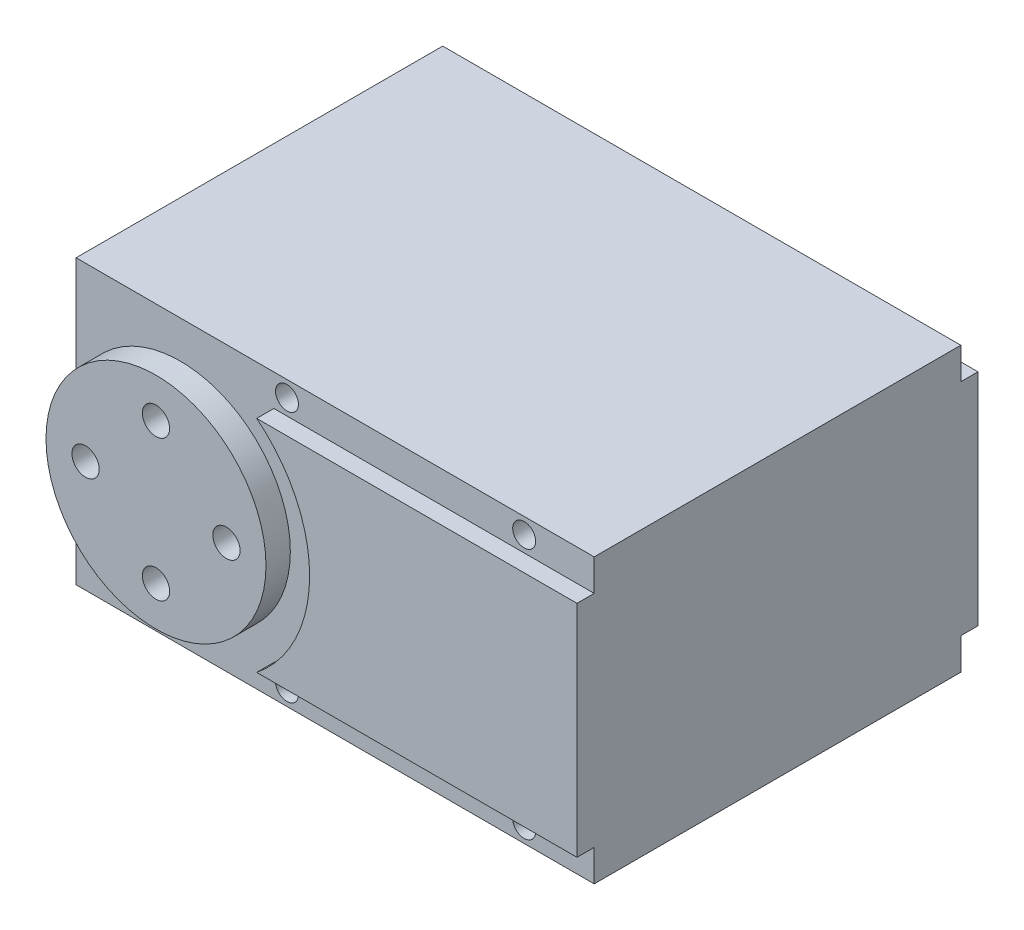
ISO-10303-21;
HEADER;
FILE_DESCRIPTION(('STEP AP214'),'2;1');
FILE_NAME('part.step','',(''),(''),'','','');
FILE_SCHEMA(('AUTOMOTIVE_DESIGN { 1 0 10303 214 1 1 1 1 }'));
ENDSEC;
DATA;
#1=APPLICATION_CONTEXT('core data for automotive mechanical design processes');
#2=APPLICATION_PROTOCOL_DEFINITION('international standard','automotive_design',2000,#1);
#3=PRODUCT_CONTEXT('',#1,'mechanical');
#4=PRODUCT('Part','Part','',(#3));
#5=PRODUCT_RELATED_PRODUCT_CATEGORY('part','',(#4));
#6=PRODUCT_DEFINITION_FORMATION('','',#4);
#7=PRODUCT_DEFINITION_CONTEXT('part definition',#1,'design');
#8=PRODUCT_DEFINITION('design','',#6,#7);
#9=PRODUCT_DEFINITION_SHAPE('','',#8);
#10=(LENGTH_UNIT() NAMED_UNIT(*) SI_UNIT(.MILLI.,.METRE.));
#11=(NAMED_UNIT(*) PLANE_ANGLE_UNIT() SI_UNIT($,.RADIAN.));
#12=(NAMED_UNIT(*) SI_UNIT($,.STERADIAN.) SOLID_ANGLE_UNIT());
#13=UNCERTAINTY_MEASURE_WITH_UNIT(LENGTH_MEASURE(1.E-05),#10,'distance_accuracy_value','');
#14=(GEOMETRIC_REPRESENTATION_CONTEXT(3) GLOBAL_UNCERTAINTY_ASSIGNED_CONTEXT((#13)) GLOBAL_UNIT_ASSIGNED_CONTEXT((#10,
#11,#12)) REPRESENTATION_CONTEXT('',''));
#15=CARTESIAN_POINT('',(0.,0.,0.));
#16=DIRECTION('',(0.,0.,1.));
#17=DIRECTION('',(1.,0.,0.));
#18=AXIS2_PLACEMENT_3D('',#15,#16,#17);
#19=CARTESIAN_POINT('',(-13.01,0.,-17.5));
#20=DIRECTION('',(0.,0.,1.));
#21=DIRECTION('',(1.,0.,0.));
#22=AXIS2_PLACEMENT_3D('',#19,#20,#21);
#23=CYLINDRICAL_SURFACE('',#22,12.28389093151);
#24=CARTESIAN_POINT('',(-13.01,0.,-16.));
#25=DIRECTION('',(0.,0.,1.));
#26=DIRECTION('',(1.,0.,0.));
#27=AXIS2_PLACEMENT_3D('',#24,#25,#26);
#28=CIRCLE('',#27,12.28389093151);
#29=CARTESIAN_POINT('',(-5.34619047619048,-9.6,-16.));
#30=VERTEX_POINT('',#29);
#31=CARTESIAN_POINT('',(-5.34619047619048,9.6,-16.));
#32=VERTEX_POINT('',#31);
#33=EDGE_CURVE('E232',#30,#32,#28,.T.);
#34=ORIENTED_EDGE('',*,*,#33,.T.);
#35=DIRECTION('',(0.,0.,1.));
#36=VECTOR('',#35,1.);
#37=CARTESIAN_POINT('',(-5.34619047619048,9.6,-17.5));
#38=LINE('',#37,#36);
#39=CARTESIAN_POINT('',(-5.34619047619048,9.6,-17.5));
#40=VERTEX_POINT('',#39);
#41=EDGE_CURVE('E11',#40,#32,#38,.T.);
#42=ORIENTED_EDGE('',*,*,#41,.F.);
#43=CARTESIAN_POINT('',(-13.01,0.,-17.5));
#44=DIRECTION('',(0.,0.,1.));
#45=DIRECTION('',(1.,0.,0.));
#46=AXIS2_PLACEMENT_3D('',#43,#44,#45);
#47=CIRCLE('',#46,12.28389093151);
#48=CARTESIAN_POINT('',(-5.34619047619048,-9.6,-17.5));
#49=VERTEX_POINT('',#48);
#50=EDGE_CURVE('E272',#49,#40,#47,.T.);
#51=ORIENTED_EDGE('',*,*,#50,.F.);
#52=DIRECTION('',(0.,0.,1.));
#53=VECTOR('',#52,1.);
#54=CARTESIAN_POINT('',(-5.34619047619048,-9.6,-17.5));
#55=LINE('',#54,#53);
#56=EDGE_CURVE('E295',#49,#30,#55,.T.);
#57=ORIENTED_EDGE('',*,*,#56,.T.);
#58=EDGE_LOOP('',(#34,#42,#51,#57));
#59=FACE_BOUND('',#58,.T.);
#60=ADVANCED_FACE('F41',(#59),#23,.F.);
#61=CARTESIAN_POINT('',(0.,9.6,-17.5));
#62=DIRECTION('',(0.,-1.,0.));
#63=DIRECTION('',(1.,0.,0.));
#64=AXIS2_PLACEMENT_3D('',#61,#62,#63);
#65=PLANE('',#64);
#66=DIRECTION('',(1.,0.,0.));
#67=VECTOR('',#66,1.);
#68=CARTESIAN_POINT('',(0.,9.6,-16.));
#69=LINE('',#68,#67);
#70=CARTESIAN_POINT('',(22.61,9.6,-16.));
#71=VERTEX_POINT('',#70);
#72=EDGE_CURVE('E231',#32,#71,#69,.T.);
#73=ORIENTED_EDGE('',*,*,#72,.T.);
#74=DIRECTION('',(0.,0.,1.));
#75=VECTOR('',#74,1.);
#76=CARTESIAN_POINT('',(22.61,9.6,-17.5));
#77=LINE('',#76,#75);
#78=CARTESIAN_POINT('',(22.61,9.6,-17.5));
#79=VERTEX_POINT('',#78);
#80=EDGE_CURVE('E284',#79,#71,#77,.T.);
#81=ORIENTED_EDGE('',*,*,#80,.F.);
#82=DIRECTION('',(1.,0.,0.));
#83=VECTOR('',#82,1.);
#84=CARTESIAN_POINT('',(0.,9.6,-17.5));
#85=LINE('',#84,#83);
#86=EDGE_CURVE('E285',#40,#79,#85,.T.);
#87=ORIENTED_EDGE('',*,*,#86,.F.);
#88=ORIENTED_EDGE('',*,*,#41,.T.);
#89=EDGE_LOOP('',(#73,#81,#87,#88));
#90=FACE_BOUND('',#89,.T.);
#91=ADVANCED_FACE('F348',(#90),#65,.F.);
#92=CARTESIAN_POINT('',(0.,-9.6,-17.5));
#93=DIRECTION('',(0.,-1.,0.));
#94=DIRECTION('',(0.,0.,-1.));
#95=AXIS2_PLACEMENT_3D('',#92,#93,#94);
#96=PLANE('',#95);
#97=DIRECTION('',(0.,0.,1.));
#98=VECTOR('',#97,1.);
#99=CARTESIAN_POINT('',(22.61,-9.6,-17.5));
#100=LINE('',#99,#98);
#101=CARTESIAN_POINT('',(22.61,-9.6,-17.5));
#102=VERTEX_POINT('',#101);
#103=CARTESIAN_POINT('',(22.61,-9.6,-16.));
#104=VERTEX_POINT('',#103);
#105=EDGE_CURVE('E290',#102,#104,#100,.T.);
#106=ORIENTED_EDGE('',*,*,#105,.T.);
#107=DIRECTION('',(1.,0.,0.));
#108=VECTOR('',#107,1.);
#109=CARTESIAN_POINT('',(0.,-9.6,-16.));
#110=LINE('',#109,#108);
#111=EDGE_CURVE('E229',#30,#104,#110,.T.);
#112=ORIENTED_EDGE('',*,*,#111,.F.);
#113=ORIENTED_EDGE('',*,*,#56,.F.);
#114=DIRECTION('',(1.,0.,0.));
#115=VECTOR('',#114,1.);
#116=CARTESIAN_POINT('',(0.,-9.6,-17.5));
#117=LINE('',#116,#115);
#118=EDGE_CURVE('E277',#49,#102,#117,.T.);
#119=ORIENTED_EDGE('',*,*,#118,.T.);
#120=EDGE_LOOP('',(#106,#112,#113,#119));
#121=FACE_BOUND('',#120,.T.);
#122=ADVANCED_FACE('F358',(#121),#96,.T.);
#123=CARTESIAN_POINT('',(-5.34619047619048,9.6,16.));
#124=VERTEX_POINT('',#123);
#125=CARTESIAN_POINT('',(-5.34619047619048,9.6,17.5));
#126=VERTEX_POINT('',#125);
#127=EDGE_CURVE('E49',#124,#126,#38,.T.);
#128=ORIENTED_EDGE('',*,*,#127,.F.);
#129=CARTESIAN_POINT('',(-13.01,0.,16.));
#130=DIRECTION('',(0.,0.,1.));
#131=DIRECTION('',(1.,0.,0.));
#132=AXIS2_PLACEMENT_3D('',#129,#130,#131);
#133=CIRCLE('',#132,12.28389093151);
#134=CARTESIAN_POINT('',(-5.34619047619048,-9.6,16.));
#135=VERTEX_POINT('',#134);
#136=EDGE_CURVE('E200',#135,#124,#133,.T.);
#137=ORIENTED_EDGE('',*,*,#136,.F.);
#138=CARTESIAN_POINT('',(-5.34619047619048,-9.6,17.5));
#139=VERTEX_POINT('',#138);
#140=EDGE_CURVE('E282',#135,#139,#55,.T.);
#141=ORIENTED_EDGE('',*,*,#140,.T.);
#142=CARTESIAN_POINT('',(-13.01,0.,17.5));
#143=DIRECTION('',(0.,0.,1.));
#144=DIRECTION('',(1.,0.,0.));
#145=AXIS2_PLACEMENT_3D('',#142,#143,#144);
#146=CIRCLE('',#145,12.28389093151);
#147=EDGE_CURVE('E254',#139,#126,#146,.T.);
#148=ORIENTED_EDGE('',*,*,#147,.T.);
#149=EDGE_LOOP('',(#128,#137,#141,#148));
#150=FACE_BOUND('',#149,.T.);
#151=ADVANCED_FACE('F43',(#150),#23,.F.);
#152=CARTESIAN_POINT('',(22.61,9.6,16.));
#153=VERTEX_POINT('',#152);
#154=CARTESIAN_POINT('',(22.61,9.6,17.5));
#155=VERTEX_POINT('',#154);
#156=EDGE_CURVE('E287',#153,#155,#77,.T.);
#157=ORIENTED_EDGE('',*,*,#156,.F.);
#158=DIRECTION('',(1.,0.,0.));
#159=VECTOR('',#158,1.);
#160=CARTESIAN_POINT('',(0.,9.6,16.));
#161=LINE('',#160,#159);
#162=EDGE_CURVE('E62',#124,#153,#161,.T.);
#163=ORIENTED_EDGE('',*,*,#162,.F.);
#164=ORIENTED_EDGE('',*,*,#127,.T.);
#165=DIRECTION('',(1.,0.,0.));
#166=VECTOR('',#165,1.);
#167=CARTESIAN_POINT('',(0.,9.6,17.5));
#168=LINE('',#167,#166);
#169=EDGE_CURVE('E269',#126,#155,#168,.T.);
#170=ORIENTED_EDGE('',*,*,#169,.T.);
#171=EDGE_LOOP('',(#157,#163,#164,#170));
#172=FACE_BOUND('',#171,.T.);
#173=ADVANCED_FACE('F360',(#172),#65,.F.);
#174=CARTESIAN_POINT('',(22.61,0.,-17.5));
#175=DIRECTION('',(1.,0.,0.));
#176=DIRECTION('',(0.,0.,-1.));
#177=AXIS2_PLACEMENT_3D('',#174,#175,#176);
#178=PLANE('',#177);
#179=ORIENTED_EDGE('',*,*,#80,.T.);
#180=DIRECTION('',(0.,1.,0.));
#181=VECTOR('',#180,1.);
#182=CARTESIAN_POINT('',(22.61,0.,-16.));
#183=LINE('',#182,#181);
#184=CARTESIAN_POINT('',(22.61,12.36,-16.));
#185=VERTEX_POINT('',#184);
#186=EDGE_CURVE('E240',#71,#185,#183,.T.);
#187=ORIENTED_EDGE('',*,*,#186,.T.);
#188=DIRECTION('',(0.,0.,1.));
#189=VECTOR('',#188,1.);
#190=CARTESIAN_POINT('',(22.61,12.36,-16.));
#191=LINE('',#190,#189);
#192=CARTESIAN_POINT('',(22.61,12.36,16.));
#193=VERTEX_POINT('',#192);
#194=EDGE_CURVE('E251',#185,#193,#191,.T.);
#195=ORIENTED_EDGE('',*,*,#194,.T.);
#196=DIRECTION('',(0.,1.,0.));
#197=VECTOR('',#196,1.);
#198=CARTESIAN_POINT('',(22.61,0.,16.));
#199=LINE('',#198,#197);
#200=EDGE_CURVE('E201',#153,#193,#199,.T.);
#201=ORIENTED_EDGE('',*,*,#200,.F.);
#202=ORIENTED_EDGE('',*,*,#156,.T.);
#203=DIRECTION('',(0.,1.,0.));
#204=VECTOR('',#203,1.);
#205=CARTESIAN_POINT('',(22.61,0.,17.5));
#206=LINE('',#205,#204);
#207=CARTESIAN_POINT('',(22.61,-9.6,17.5));
#208=VERTEX_POINT('',#207);
#209=EDGE_CURVE('E270',#208,#155,#206,.T.);
#210=ORIENTED_EDGE('',*,*,#209,.F.);
#211=CARTESIAN_POINT('',(22.61,-9.6,16.));
#212=VERTEX_POINT('',#211);
#213=EDGE_CURVE('E292',#212,#208,#100,.T.);
#214=ORIENTED_EDGE('',*,*,#213,.F.);
#215=DIRECTION('',(0.,1.,0.));
#216=VECTOR('',#215,1.);
#217=CARTESIAN_POINT('',(22.61,0.,16.));
#218=LINE('',#217,#216);
#219=CARTESIAN_POINT('',(22.61,-12.36,16.));
#220=VERTEX_POINT('',#219);
#221=EDGE_CURVE('E195',#220,#212,#218,.T.);
#222=ORIENTED_EDGE('',*,*,#221,.F.);
#223=DIRECTION('',(0.,0.,1.));
#224=VECTOR('',#223,1.);
#225=CARTESIAN_POINT('',(22.61,-12.36,-16.));
#226=LINE('',#225,#224);
#227=CARTESIAN_POINT('',(22.61,-12.36,-16.));
#228=VERTEX_POINT('',#227);
#229=EDGE_CURVE('E258',#228,#220,#226,.T.);
#230=ORIENTED_EDGE('',*,*,#229,.F.);
#231=DIRECTION('',(0.,1.,0.));
#232=VECTOR('',#231,1.);
#233=CARTESIAN_POINT('',(22.61,0.,-16.));
#234=LINE('',#233,#232);
#235=EDGE_CURVE('E230',#228,#104,#234,.T.);
#236=ORIENTED_EDGE('',*,*,#235,.T.);
#237=ORIENTED_EDGE('',*,*,#105,.F.);
#238=DIRECTION('',(0.,1.,0.));
#239=VECTOR('',#238,1.);
#240=CARTESIAN_POINT('',(22.61,0.,-17.5));
#241=LINE('',#240,#239);
#242=EDGE_CURVE('E276',#102,#79,#241,.T.);
#243=ORIENTED_EDGE('',*,*,#242,.T.);
#244=EDGE_LOOP('',(#179,#187,#195,#201,#202,#210,#214,#222,#230,#236,#237,#243));
#245=FACE_BOUND('',#244,.T.);
#246=ADVANCED_FACE('F368',(#245),#178,.T.);
#247=DIRECTION('',(1.,0.,0.));
#248=VECTOR('',#247,1.);
#249=CARTESIAN_POINT('',(0.,-9.6,16.));
#250=LINE('',#249,#248);
#251=EDGE_CURVE('E197',#135,#212,#250,.T.);
#252=ORIENTED_EDGE('',*,*,#251,.T.);
#253=ORIENTED_EDGE('',*,*,#213,.T.);
#254=DIRECTION('',(1.,0.,0.));
#255=VECTOR('',#254,1.);
#256=CARTESIAN_POINT('',(0.,-9.6,17.5));
#257=LINE('',#256,#255);
#258=EDGE_CURVE('E262',#139,#208,#257,.T.);
#259=ORIENTED_EDGE('',*,*,#258,.F.);
#260=ORIENTED_EDGE('',*,*,#140,.F.);
#261=EDGE_LOOP('',(#252,#253,#259,#260));
#262=FACE_BOUND('',#261,.T.);
#263=ADVANCED_FACE('F366',(#262),#96,.T.);
#264=CARTESIAN_POINT('',(0.,0.,-17.5));
#265=DIRECTION('',(0.,0.,1.));
#266=DIRECTION('',(1.,0.,0.));
#267=AXIS2_PLACEMENT_3D('',#264,#265,#266);
#268=PLANE('',#267);
#269=ORIENTED_EDGE('',*,*,#50,.T.);
#270=ORIENTED_EDGE('',*,*,#86,.T.);
#271=ORIENTED_EDGE('',*,*,#242,.F.);
#272=ORIENTED_EDGE('',*,*,#118,.F.);
#273=EDGE_LOOP('',(#269,#270,#271,#272));
#274=FACE_BOUND('',#273,.T.);
#275=ADVANCED_FACE('F390',(#274),#268,.F.);
#276=CARTESIAN_POINT('',(0.,0.,17.5));
#277=DIRECTION('',(0.,0.,1.));
#278=DIRECTION('',(1.,0.,0.));
#279=AXIS2_PLACEMENT_3D('',#276,#277,#278);
#280=PLANE('',#279);
#281=ORIENTED_EDGE('',*,*,#147,.F.);
#282=ORIENTED_EDGE('',*,*,#258,.T.);
#283=ORIENTED_EDGE('',*,*,#209,.T.);
#284=ORIENTED_EDGE('',*,*,#169,.F.);
#285=EDGE_LOOP('',(#281,#282,#283,#284));
#286=FACE_BOUND('',#285,.T.);
#287=ADVANCED_FACE('F384',(#286),#280,.T.);
#288=CARTESIAN_POINT('',(0.,12.36,-16.));
#289=DIRECTION('',(0.,-1.,0.));
#290=DIRECTION('',(0.,0.,-1.));
#291=AXIS2_PLACEMENT_3D('',#288,#289,#290);
#292=PLANE('',#291);
#293=DIRECTION('',(0.,0.,1.));
#294=VECTOR('',#293,1.);
#295=CARTESIAN_POINT('',(-22.61,12.36,-16.));
#296=LINE('',#295,#294);
#297=CARTESIAN_POINT('',(-22.61,12.36,-16.));
#298=VERTEX_POINT('',#297);
#299=CARTESIAN_POINT('',(-22.61,12.36,16.));
#300=VERTEX_POINT('',#299);
#301=EDGE_CURVE('E252',#298,#300,#296,.T.);
#302=ORIENTED_EDGE('',*,*,#301,.T.);
#303=DIRECTION('',(1.,0.,0.));
#304=VECTOR('',#303,1.);
#305=CARTESIAN_POINT('',(0.,12.36,16.));
#306=LINE('',#305,#304);
#307=EDGE_CURVE('E186',#300,#193,#306,.T.);
#308=ORIENTED_EDGE('',*,*,#307,.T.);
#309=ORIENTED_EDGE('',*,*,#194,.F.);
#310=DIRECTION('',(1.,0.,0.));
#311=VECTOR('',#310,1.);
#312=CARTESIAN_POINT('',(0.,12.36,-16.));
#313=LINE('',#312,#311);
#314=EDGE_CURVE('E217',#298,#185,#313,.T.);
#315=ORIENTED_EDGE('',*,*,#314,.F.);
#316=EDGE_LOOP('',(#302,#308,#309,#315));
#317=FACE_BOUND('',#316,.T.);
#318=ADVANCED_FACE('F387',(#317),#292,.F.);
#319=CARTESIAN_POINT('',(0.,-12.36,-16.));
#320=DIRECTION('',(0.,-1.,0.));
#321=DIRECTION('',(0.,0.,-1.));
#322=AXIS2_PLACEMENT_3D('',#319,#320,#321);
#323=PLANE('',#322);
#324=ORIENTED_EDGE('',*,*,#229,.T.);
#325=DIRECTION('',(1.,0.,0.));
#326=VECTOR('',#325,1.);
#327=CARTESIAN_POINT('',(0.,-12.36,16.));
#328=LINE('',#327,#326);
#329=CARTESIAN_POINT('',(-22.61,-12.36,16.));
#330=VERTEX_POINT('',#329);
#331=EDGE_CURVE('E193',#330,#220,#328,.T.);
#332=ORIENTED_EDGE('',*,*,#331,.F.);
#333=DIRECTION('',(0.,0.,1.));
#334=VECTOR('',#333,1.);
#335=CARTESIAN_POINT('',(-22.61,-12.36,-16.));
#336=LINE('',#335,#334);
#337=CARTESIAN_POINT('',(-22.61,-12.36,-16.));
#338=VERTEX_POINT('',#337);
#339=EDGE_CURVE('E256',#338,#330,#336,.T.);
#340=ORIENTED_EDGE('',*,*,#339,.F.);
#341=DIRECTION('',(1.,0.,0.));
#342=VECTOR('',#341,1.);
#343=CARTESIAN_POINT('',(0.,-12.36,-16.));
#344=LINE('',#343,#342);
#345=EDGE_CURVE('E221',#338,#228,#344,.T.);
#346=ORIENTED_EDGE('',*,*,#345,.T.);
#347=EDGE_LOOP('',(#324,#332,#340,#346));
#348=FACE_BOUND('',#347,.T.);
#349=ADVANCED_FACE('F392',(#348),#323,.T.);
#350=CARTESIAN_POINT('',(-4.2,-10.98,-16.));
#351=DIRECTION('',(0.,0.,1.));
#352=DIRECTION('',(1.,0.,0.));
#353=AXIS2_PLACEMENT_3D('',#350,#351,#352);
#354=CYLINDRICAL_SURFACE('',#353,1.);
#355=CARTESIAN_POINT('',(-4.2,-10.98,-16.));
#356=DIRECTION('',(0.,0.,1.));
#357=DIRECTION('',(1.,0.,0.));
#358=AXIS2_PLACEMENT_3D('',#355,#356,#357);
#359=CIRCLE('',#358,1.);
#360=CARTESIAN_POINT('',(-3.19999999999999,-10.98,-16.));
#361=VERTEX_POINT('',#360);
#362=EDGE_CURVE('E248',#361,#361,#359,.T.);
#363=ORIENTED_EDGE('',*,*,#362,.F.);
#364=EDGE_LOOP('',(#363));
#365=FACE_BOUND('',#364,.T.);
#366=CARTESIAN_POINT('',(-4.2,-10.98,16.));
#367=DIRECTION('',(0.,0.,1.));
#368=DIRECTION('',(1.,0.,0.));
#369=AXIS2_PLACEMENT_3D('',#366,#367,#368);
#370=CIRCLE('',#369,1.);
#371=CARTESIAN_POINT('',(-3.19999999999999,-10.98,16.));
#372=VERTEX_POINT('',#371);
#373=EDGE_CURVE('E215',#372,#372,#370,.T.);
#374=ORIENTED_EDGE('',*,*,#373,.T.);
#375=EDGE_LOOP('',(#374));
#376=FACE_BOUND('',#375,.T.);
#377=ADVANCED_FACE('F419',(#365,#376),#354,.F.);
#378=CARTESIAN_POINT('',(-4.2,10.98,-16.));
#379=DIRECTION('',(0.,0.,1.));
#380=DIRECTION('',(1.,0.,0.));
#381=AXIS2_PLACEMENT_3D('',#378,#379,#380);
#382=CYLINDRICAL_SURFACE('',#381,1.);
#383=CARTESIAN_POINT('',(-4.2,10.98,-16.));
#384=DIRECTION('',(0.,0.,1.));
#385=DIRECTION('',(1.,0.,0.));
#386=AXIS2_PLACEMENT_3D('',#383,#384,#385);
#387=CIRCLE('',#386,1.);
#388=CARTESIAN_POINT('',(-3.19999999999999,10.98,-16.));
#389=VERTEX_POINT('',#388);
#390=EDGE_CURVE('E242',#389,#389,#387,.F.);
#391=ORIENTED_EDGE('',*,*,#390,.T.);
#392=EDGE_LOOP('',(#391));
#393=FACE_BOUND('',#392,.T.);
#394=CARTESIAN_POINT('',(-4.2,10.98,16.));
#395=DIRECTION('',(0.,0.,1.));
#396=DIRECTION('',(1.,0.,0.));
#397=AXIS2_PLACEMENT_3D('',#394,#395,#396);
#398=CIRCLE('',#397,1.);
#399=CARTESIAN_POINT('',(-3.19999999999999,10.98,16.));
#400=VERTEX_POINT('',#399);
#401=EDGE_CURVE('E207',#400,#400,#398,.F.);
#402=ORIENTED_EDGE('',*,*,#401,.F.);
#403=EDGE_LOOP('',(#402));
#404=FACE_BOUND('',#403,.T.);
#405=ADVANCED_FACE('F427',(#393,#404),#382,.F.);
#406=CARTESIAN_POINT('',(16.5,10.98,-16.));
#407=DIRECTION('',(0.,0.,1.));
#408=DIRECTION('',(1.,0.,0.));
#409=AXIS2_PLACEMENT_3D('',#406,#407,#408);
#410=CYLINDRICAL_SURFACE('',#409,1.);
#411=CARTESIAN_POINT('',(16.5,10.98,-16.));
#412=DIRECTION('',(0.,0.,1.));
#413=DIRECTION('',(1.,0.,0.));
#414=AXIS2_PLACEMENT_3D('',#411,#412,#413);
#415=CIRCLE('',#414,1.);
#416=CARTESIAN_POINT('',(17.5,10.98,-16.));
#417=VERTEX_POINT('',#416);
#418=EDGE_CURVE('E238',#417,#417,#415,.F.);
#419=ORIENTED_EDGE('',*,*,#418,.T.);
#420=EDGE_LOOP('',(#419));
#421=FACE_BOUND('',#420,.T.);
#422=CARTESIAN_POINT('',(16.5,10.98,16.));
#423=DIRECTION('',(0.,0.,1.));
#424=DIRECTION('',(1.,0.,0.));
#425=AXIS2_PLACEMENT_3D('',#422,#423,#424);
#426=CIRCLE('',#425,1.);
#427=CARTESIAN_POINT('',(17.5,10.98,16.));
#428=VERTEX_POINT('',#427);
#429=EDGE_CURVE('E206',#428,#428,#426,.F.);
#430=ORIENTED_EDGE('',*,*,#429,.F.);
#431=EDGE_LOOP('',(#430));
#432=FACE_BOUND('',#431,.T.);
#433=ADVANCED_FACE('F437',(#421,#432),#410,.F.);
#434=CARTESIAN_POINT('',(-22.61,0.,-16.));
#435=DIRECTION('',(1.,0.,0.));
#436=DIRECTION('',(0.,0.,-1.));
#437=AXIS2_PLACEMENT_3D('',#434,#435,#436);
#438=PLANE('',#437);
#439=DIRECTION('',(0.,1.,0.));
#440=VECTOR('',#439,1.);
#441=CARTESIAN_POINT('',(-22.61,0.,-16.));
#442=LINE('',#441,#440);
#443=CARTESIAN_POINT('',(-22.61,0.,-16.));
#444=VERTEX_POINT('',#443);
#445=EDGE_CURVE('E219',#444,#298,#442,.T.);
#446=ORIENTED_EDGE('',*,*,#445,.F.);
#447=EDGE_CURVE('E222',#338,#444,#442,.T.);
#448=ORIENTED_EDGE('',*,*,#447,.F.);
#449=ORIENTED_EDGE('',*,*,#339,.T.);
#450=DIRECTION('',(0.,1.,0.));
#451=VECTOR('',#450,1.);
#452=CARTESIAN_POINT('',(-22.61,0.,16.));
#453=LINE('',#452,#451);
#454=EDGE_CURVE('E188',#330,#300,#453,.T.);
#455=ORIENTED_EDGE('',*,*,#454,.T.);
#456=ORIENTED_EDGE('',*,*,#301,.F.);
#457=EDGE_LOOP('',(#446,#448,#449,#455,#456));
#458=FACE_BOUND('',#457,.T.);
#459=ADVANCED_FACE('F450',(#458),#438,.F.);
#460=CARTESIAN_POINT('',(16.5,-10.98,-16.));
#461=DIRECTION('',(0.,0.,1.));
#462=DIRECTION('',(1.,0.,0.));
#463=AXIS2_PLACEMENT_3D('',#460,#461,#462);
#464=CYLINDRICAL_SURFACE('',#463,1.);
#465=CARTESIAN_POINT('',(16.5,-10.98,-16.));
#466=DIRECTION('',(0.,0.,1.));
#467=DIRECTION('',(1.,0.,0.));
#468=AXIS2_PLACEMENT_3D('',#465,#466,#467);
#469=CIRCLE('',#468,1.);
#470=CARTESIAN_POINT('',(17.5,-10.98,-16.));
#471=VERTEX_POINT('',#470);
#472=EDGE_CURVE('E250',#471,#471,#469,.T.);
#473=ORIENTED_EDGE('',*,*,#472,.F.);
#474=EDGE_LOOP('',(#473));
#475=FACE_BOUND('',#474,.T.);
#476=CARTESIAN_POINT('',(16.5,-10.98,16.));
#477=DIRECTION('',(0.,0.,1.));
#478=DIRECTION('',(1.,0.,0.));
#479=AXIS2_PLACEMENT_3D('',#476,#477,#478);
#480=CIRCLE('',#479,1.);
#481=CARTESIAN_POINT('',(17.5,-10.98,16.));
#482=VERTEX_POINT('',#481);
#483=EDGE_CURVE('E214',#482,#482,#480,.T.);
#484=ORIENTED_EDGE('',*,*,#483,.T.);
#485=EDGE_LOOP('',(#484));
#486=FACE_BOUND('',#485,.T.);
#487=ADVANCED_FACE('F455',(#475,#486),#464,.F.);
#488=CARTESIAN_POINT('',(0.,0.,-16.));
#489=DIRECTION('',(0.,0.,1.));
#490=DIRECTION('',(1.,0.,0.));
#491=AXIS2_PLACEMENT_3D('',#488,#489,#490);
#492=PLANE('',#491);
#493=ORIENTED_EDGE('',*,*,#447,.T.);
#494=CARTESIAN_POINT('',(-13.01,0.,-16.));
#495=DIRECTION('',(0.,0.,1.));
#496=DIRECTION('',(1.,0.,0.));
#497=AXIS2_PLACEMENT_3D('',#494,#495,#496);
#498=CIRCLE('',#497,9.6);
#499=EDGE_CURVE('E57',#444,#444,#498,.T.);
#500=ORIENTED_EDGE('',*,*,#499,.T.);
#501=ORIENTED_EDGE('',*,*,#445,.T.);
#502=ORIENTED_EDGE('',*,*,#314,.T.);
#503=ORIENTED_EDGE('',*,*,#186,.F.);
#504=ORIENTED_EDGE('',*,*,#72,.F.);
#505=ORIENTED_EDGE('',*,*,#33,.F.);
#506=ORIENTED_EDGE('',*,*,#111,.T.);
#507=ORIENTED_EDGE('',*,*,#235,.F.);
#508=ORIENTED_EDGE('',*,*,#345,.F.);
#509=EDGE_LOOP('',(#493,#500,#501,#502,#503,#504,#505,#506,#507,#508));
#510=FACE_BOUND('',#509,.T.);
#511=ORIENTED_EDGE('',*,*,#418,.F.);
#512=EDGE_LOOP('',(#511));
#513=FACE_BOUND('',#512,.T.);
#514=ORIENTED_EDGE('',*,*,#390,.F.);
#515=EDGE_LOOP('',(#514));
#516=FACE_BOUND('',#515,.T.);
#517=ORIENTED_EDGE('',*,*,#362,.T.);
#518=EDGE_LOOP('',(#517));
#519=FACE_BOUND('',#518,.T.);
#520=ORIENTED_EDGE('',*,*,#472,.T.);
#521=EDGE_LOOP('',(#520));
#522=FACE_BOUND('',#521,.T.);
#523=ADVANCED_FACE('F456',(#510,#513,#516,#519,#522),#492,.F.);
#524=CARTESIAN_POINT('',(0.,0.,16.));
#525=DIRECTION('',(0.,0.,1.));
#526=DIRECTION('',(1.,0.,0.));
#527=AXIS2_PLACEMENT_3D('',#524,#525,#526);
#528=PLANE('',#527);
#529=ORIENTED_EDGE('',*,*,#307,.F.);
#530=ORIENTED_EDGE('',*,*,#454,.F.);
#531=ORIENTED_EDGE('',*,*,#331,.T.);
#532=ORIENTED_EDGE('',*,*,#221,.T.);
#533=ORIENTED_EDGE('',*,*,#251,.F.);
#534=ORIENTED_EDGE('',*,*,#136,.T.);
#535=ORIENTED_EDGE('',*,*,#162,.T.);
#536=ORIENTED_EDGE('',*,*,#200,.T.);
#537=EDGE_LOOP('',(#529,#530,#531,#532,#533,#534,#535,#536));
#538=FACE_BOUND('',#537,.T.);
#539=ORIENTED_EDGE('',*,*,#429,.T.);
#540=EDGE_LOOP('',(#539));
#541=FACE_BOUND('',#540,.T.);
#542=ORIENTED_EDGE('',*,*,#401,.T.);
#543=EDGE_LOOP('',(#542));
#544=FACE_BOUND('',#543,.T.);
#545=ORIENTED_EDGE('',*,*,#373,.F.);
#546=EDGE_LOOP('',(#545));
#547=FACE_BOUND('',#546,.T.);
#548=ORIENTED_EDGE('',*,*,#483,.F.);
#549=EDGE_LOOP('',(#548));
#550=FACE_BOUND('',#549,.T.);
#551=CARTESIAN_POINT('',(-13.01,0.,16.));
#552=DIRECTION('',(0.,0.,1.));
#553=DIRECTION('',(1.,0.,0.));
#554=AXIS2_PLACEMENT_3D('',#551,#552,#553);
#555=CIRCLE('',#554,4.);
#556=CARTESIAN_POINT('',(-9.01,0.,16.));
#557=VERTEX_POINT('',#556);
#558=EDGE_CURVE('E310',#557,#557,#555,.T.);
#559=ORIENTED_EDGE('',*,*,#558,.F.);
#560=EDGE_LOOP('',(#559));
#561=FACE_BOUND('',#560,.T.);
#562=CARTESIAN_POINT('',(-13.01,6.14826322224311,16.));
#563=DIRECTION('',(0.,0.,1.));
#564=DIRECTION('',(1.,0.,0.));
#565=AXIS2_PLACEMENT_3D('',#562,#563,#564);
#566=CIRCLE('',#565,1.19125999999999);
#567=CARTESIAN_POINT('',(-11.81874,6.14826322224311,16.));
#568=VERTEX_POINT('',#567);
#569=EDGE_CURVE('E294',#568,#568,#566,.F.);
#570=ORIENTED_EDGE('',*,*,#569,.T.);
#571=EDGE_LOOP('',(#570));
#572=FACE_BOUND('',#571,.T.);
#573=CARTESIAN_POINT('',(-6.86173677775688,0.,16.));
#574=DIRECTION('',(0.,0.,1.));
#575=DIRECTION('',(1.,0.,0.));
#576=AXIS2_PLACEMENT_3D('',#573,#574,#575);
#577=CIRCLE('',#576,1.19125999999999);
#578=CARTESIAN_POINT('',(-5.67047677775689,0.,16.));
#579=VERTEX_POINT('',#578);
#580=EDGE_CURVE('E296',#579,#579,#577,.F.);
#581=ORIENTED_EDGE('',*,*,#580,.T.);
#582=EDGE_LOOP('',(#581));
#583=FACE_BOUND('',#582,.T.);
#584=CARTESIAN_POINT('',(-13.01,-6.14826322224311,16.));
#585=DIRECTION('',(0.,0.,1.));
#586=DIRECTION('',(1.,0.,0.));
#587=AXIS2_PLACEMENT_3D('',#584,#585,#586);
#588=CIRCLE('',#587,1.19125999999999);
#589=CARTESIAN_POINT('',(-11.81874,-6.14826322224311,16.));
#590=VERTEX_POINT('',#589);
#591=EDGE_CURVE('E303',#590,#590,#588,.F.);
#592=ORIENTED_EDGE('',*,*,#591,.T.);
#593=EDGE_LOOP('',(#592));
#594=FACE_BOUND('',#593,.T.);
#595=CARTESIAN_POINT('',(-19.1582632222431,0.,16.));
#596=DIRECTION('',(0.,0.,1.));
#597=DIRECTION('',(1.,0.,0.));
#598=AXIS2_PLACEMENT_3D('',#595,#596,#597);
#599=CIRCLE('',#598,1.19125999999999);
#600=CARTESIAN_POINT('',(-17.9670032222431,0.,16.));
#601=VERTEX_POINT('',#600);
#602=EDGE_CURVE('E312',#601,#601,#599,.F.);
#603=ORIENTED_EDGE('',*,*,#602,.T.);
#604=EDGE_LOOP('',(#603));
#605=FACE_BOUND('',#604,.T.);
#606=ADVANCED_FACE('F374',(#538,#541,#544,#547,#550,#561,#572,#583,#594,#605),#528,.T.);
#607=CARTESIAN_POINT('',(-13.01,0.,-18.625));
#608=DIRECTION('',(0.,0.,1.));
#609=DIRECTION('',(1.,0.,0.));
#610=AXIS2_PLACEMENT_3D('',#607,#608,#609);
#611=CYLINDRICAL_SURFACE('',#610,9.6);
#612=CARTESIAN_POINT('',(-13.01,0.,-18.625));
#613=DIRECTION('',(0.,0.,1.));
#614=DIRECTION('',(1.,0.,0.));
#615=AXIS2_PLACEMENT_3D('',#612,#613,#614);
#616=CIRCLE('',#615,9.6);
#617=CARTESIAN_POINT('',(-3.41,0.,-18.625));
#618=VERTEX_POINT('',#617);
#619=EDGE_CURVE('E185',#618,#618,#616,.T.);
#620=ORIENTED_EDGE('',*,*,#619,.T.);
#621=EDGE_LOOP('',(#620));
#622=FACE_BOUND('',#621,.T.);
#623=ORIENTED_EDGE('',*,*,#499,.F.);
#624=EDGE_LOOP('',(#623));
#625=FACE_BOUND('',#624,.T.);
#626=ADVANCED_FACE('F342',(#622,#625),#611,.T.);
#627=CARTESIAN_POINT('',(0.,0.,-18.625));
#628=DIRECTION('',(0.,0.,1.));
#629=DIRECTION('',(1.,0.,0.));
#630=AXIS2_PLACEMENT_3D('',#627,#628,#629);
#631=PLANE('',#630);
#632=ORIENTED_EDGE('',*,*,#619,.F.);
#633=EDGE_LOOP('',(#632));
#634=FACE_BOUND('',#633,.T.);
#635=ADVANCED_FACE('F335',(#634),#631,.F.);
#636=CARTESIAN_POINT('',(-13.01,0.,16.5));
#637=DIRECTION('',(0.,0.,1.));
#638=DIRECTION('',(1.,0.,0.));
#639=AXIS2_PLACEMENT_3D('',#636,#637,#638);
#640=PLANE('',#639);
#641=CARTESIAN_POINT('',(-13.01,-6.14826322224311,16.5));
#642=DIRECTION('',(0.,0.,1.));
#643=DIRECTION('',(1.,0.,0.));
#644=AXIS2_PLACEMENT_3D('',#641,#642,#643);
#645=CIRCLE('',#644,1.19125999999999);
#646=CARTESIAN_POINT('',(-11.81874,-6.14826322224311,16.5));
#647=VERTEX_POINT('',#646);
#648=EDGE_CURVE('E321',#647,#647,#645,.F.);
#649=ORIENTED_EDGE('',*,*,#648,.F.);
#650=EDGE_LOOP('',(#649));
#651=FACE_BOUND('',#650,.T.);
#652=CARTESIAN_POINT('',(-13.01,6.14826322224311,16.5));
#653=DIRECTION('',(0.,0.,1.));
#654=DIRECTION('',(1.,0.,0.));
#655=AXIS2_PLACEMENT_3D('',#652,#653,#654);
#656=CIRCLE('',#655,1.19125999999999);
#657=CARTESIAN_POINT('',(-11.81874,6.14826322224311,16.5));
#658=VERTEX_POINT('',#657);
#659=EDGE_CURVE('E44',#658,#658,#656,.F.);
#660=ORIENTED_EDGE('',*,*,#659,.F.);
#661=EDGE_LOOP('',(#660));
#662=FACE_BOUND('',#661,.T.);
#663=CARTESIAN_POINT('',(-13.01,0.,16.5));
#664=DIRECTION('',(0.,0.,1.));
#665=DIRECTION('',(1.,0.,0.));
#666=AXIS2_PLACEMENT_3D('',#663,#664,#665);
#667=CIRCLE('',#666,9.60000000000001);
#668=CARTESIAN_POINT('',(-3.40999999999999,0.,16.5));
#669=VERTEX_POINT('',#668);
#670=EDGE_CURVE('E300',#669,#669,#667,.T.);
#671=ORIENTED_EDGE('',*,*,#670,.F.);
#672=EDGE_LOOP('',(#671));
#673=FACE_BOUND('',#672,.T.);
#674=CARTESIAN_POINT('',(-13.01,0.,16.5));
#675=DIRECTION('',(0.,0.,1.));
#676=DIRECTION('',(1.,0.,0.));
#677=AXIS2_PLACEMENT_3D('',#674,#675,#676);
#678=CIRCLE('',#677,4.);
#679=CARTESIAN_POINT('',(-9.01,0.,16.5));
#680=VERTEX_POINT('',#679);
#681=EDGE_CURVE('E305',#680,#680,#678,.T.);
#682=ORIENTED_EDGE('',*,*,#681,.T.);
#683=EDGE_LOOP('',(#682));
#684=FACE_BOUND('',#683,.T.);
#685=CARTESIAN_POINT('',(-6.86173677775688,0.,16.5));
#686=DIRECTION('',(0.,0.,1.));
#687=DIRECTION('',(1.,0.,0.));
#688=AXIS2_PLACEMENT_3D('',#685,#686,#687);
#689=CIRCLE('',#688,1.19125999999999);
#690=CARTESIAN_POINT('',(-5.67047677775689,0.,16.5));
#691=VERTEX_POINT('',#690);
#692=EDGE_CURVE('E318',#691,#691,#689,.F.);
#693=ORIENTED_EDGE('',*,*,#692,.F.);
#694=EDGE_LOOP('',(#693));
#695=FACE_BOUND('',#694,.T.);
#696=CARTESIAN_POINT('',(-19.1582632222431,0.,16.5));
#697=DIRECTION('',(0.,0.,1.));
#698=DIRECTION('',(1.,0.,0.));
#699=AXIS2_PLACEMENT_3D('',#696,#697,#698);
#700=CIRCLE('',#699,1.19125999999999);
#701=CARTESIAN_POINT('',(-17.9670032222431,0.,16.5));
#702=VERTEX_POINT('',#701);
#703=EDGE_CURVE('E161',#702,#702,#700,.F.);
#704=ORIENTED_EDGE('',*,*,#703,.F.);
#705=EDGE_LOOP('',(#704));
#706=FACE_BOUND('',#705,.T.);
#707=ADVANCED_FACE('F328',(#651,#662,#673,#684,#695,#706),#640,.F.);
#708=CARTESIAN_POINT('',(-13.01,0.,16.5));
#709=DIRECTION('',(0.,0.,-1.));
#710=DIRECTION('',(-1.,0.,0.));
#711=AXIS2_PLACEMENT_3D('',#708,#709,#710);
#712=CYLINDRICAL_SURFACE('',#711,4.);
#713=ORIENTED_EDGE('',*,*,#681,.F.);
#714=EDGE_LOOP('',(#713));
#715=FACE_BOUND('',#714,.T.);
#716=ORIENTED_EDGE('',*,*,#558,.T.);
#717=EDGE_LOOP('',(#716));
#718=FACE_BOUND('',#717,.T.);
#719=ADVANCED_FACE('F332',(#715,#718),#712,.T.);
#720=ORIENTED_EDGE('',*,*,#670,.T.);
#721=EDGE_LOOP('',(#720));
#722=FACE_BOUND('',#721,.T.);
#723=CARTESIAN_POINT('',(-13.01,0.,18.625));
#724=DIRECTION('',(0.,0.,1.));
#725=DIRECTION('',(1.,0.,0.));
#726=AXIS2_PLACEMENT_3D('',#723,#724,#725);
#727=CIRCLE('',#726,9.6);
#728=CARTESIAN_POINT('',(-3.41,0.,18.625));
#729=VERTEX_POINT('',#728);
#730=EDGE_CURVE('E180',#729,#729,#727,.T.);
#731=ORIENTED_EDGE('',*,*,#730,.F.);
#732=EDGE_LOOP('',(#731));
#733=FACE_BOUND('',#732,.T.);
#734=ADVANCED_FACE('F338',(#722,#733),#611,.T.);
#735=CARTESIAN_POINT('',(-19.1582632222431,0.,18.625));
#736=DIRECTION('',(0.,0.,1.));
#737=DIRECTION('',(1.,0.,0.));
#738=AXIS2_PLACEMENT_3D('',#735,#736,#737);
#739=CYLINDRICAL_SURFACE('',#738,1.19125999999999);
#740=ORIENTED_EDGE('',*,*,#703,.T.);
#741=EDGE_LOOP('',(#740));
#742=FACE_BOUND('',#741,.T.);
#743=CARTESIAN_POINT('',(-19.1582632222431,0.,18.625));
#744=DIRECTION('',(0.,0.,1.));
#745=DIRECTION('',(1.,0.,0.));
#746=AXIS2_PLACEMENT_3D('',#743,#744,#745);
#747=CIRCLE('',#746,1.19125999999999);
#748=CARTESIAN_POINT('',(-17.9670032222431,0.,18.625));
#749=VERTEX_POINT('',#748);
#750=EDGE_CURVE('E172',#749,#749,#747,.T.);
#751=ORIENTED_EDGE('',*,*,#750,.T.);
#752=EDGE_LOOP('',(#751));
#753=FACE_BOUND('',#752,.T.);
#754=ADVANCED_FACE('F326',(#742,#753),#739,.F.);
#755=CARTESIAN_POINT('',(-13.01,-6.14826322224311,18.625));
#756=DIRECTION('',(0.,0.,1.));
#757=DIRECTION('',(1.,0.,0.));
#758=AXIS2_PLACEMENT_3D('',#755,#756,#757);
#759=CYLINDRICAL_SURFACE('',#758,1.19125999999999);
#760=ORIENTED_EDGE('',*,*,#648,.T.);
#761=EDGE_LOOP('',(#760));
#762=FACE_BOUND('',#761,.T.);
#763=CARTESIAN_POINT('',(-13.01,-6.14826322224311,18.625));
#764=DIRECTION('',(0.,0.,1.));
#765=DIRECTION('',(1.,0.,0.));
#766=AXIS2_PLACEMENT_3D('',#763,#764,#765);
#767=CIRCLE('',#766,1.19125999999999);
#768=CARTESIAN_POINT('',(-11.81874,-6.14826322224311,18.625));
#769=VERTEX_POINT('',#768);
#770=EDGE_CURVE('E170',#769,#769,#767,.T.);
#771=ORIENTED_EDGE('',*,*,#770,.T.);
#772=EDGE_LOOP('',(#771));
#773=FACE_BOUND('',#772,.T.);
#774=ADVANCED_FACE('F573',(#762,#773),#759,.F.);
#775=CARTESIAN_POINT('',(-6.86173677775688,0.,18.625));
#776=DIRECTION('',(0.,0.,1.));
#777=DIRECTION('',(1.,0.,0.));
#778=AXIS2_PLACEMENT_3D('',#775,#776,#777);
#779=CYLINDRICAL_SURFACE('',#778,1.19125999999999);
#780=ORIENTED_EDGE('',*,*,#692,.T.);
#781=EDGE_LOOP('',(#780));
#782=FACE_BOUND('',#781,.T.);
#783=CARTESIAN_POINT('',(-6.86173677775688,0.,18.625));
#784=DIRECTION('',(0.,0.,1.));
#785=DIRECTION('',(1.,0.,0.));
#786=AXIS2_PLACEMENT_3D('',#783,#784,#785);
#787=CIRCLE('',#786,1.19125999999999);
#788=CARTESIAN_POINT('',(-5.67047677775689,0.,18.625));
#789=VERTEX_POINT('',#788);
#790=EDGE_CURVE('E152',#789,#789,#787,.T.);
#791=ORIENTED_EDGE('',*,*,#790,.T.);
#792=EDGE_LOOP('',(#791));
#793=FACE_BOUND('',#792,.T.);
#794=ADVANCED_FACE('F493',(#782,#793),#779,.F.);
#795=CARTESIAN_POINT('',(0.,0.,18.625));
#796=DIRECTION('',(0.,0.,1.));
#797=DIRECTION('',(1.,0.,0.));
#798=AXIS2_PLACEMENT_3D('',#795,#796,#797);
#799=PLANE('',#798);
#800=CARTESIAN_POINT('',(-13.01,6.14826322224311,18.625));
#801=DIRECTION('',(0.,0.,1.));
#802=DIRECTION('',(1.,0.,0.));
#803=AXIS2_PLACEMENT_3D('',#800,#801,#802);
#804=CIRCLE('',#803,1.19125999999999);
#805=CARTESIAN_POINT('',(-11.81874,6.14826322224311,18.625));
#806=VERTEX_POINT('',#805);
#807=EDGE_CURVE('E154',#806,#806,#804,.T.);
#808=ORIENTED_EDGE('',*,*,#807,.F.);
#809=EDGE_LOOP('',(#808));
#810=FACE_BOUND('',#809,.T.);
#811=ORIENTED_EDGE('',*,*,#790,.F.);
#812=EDGE_LOOP('',(#811));
#813=FACE_BOUND('',#812,.T.);
#814=ORIENTED_EDGE('',*,*,#770,.F.);
#815=EDGE_LOOP('',(#814));
#816=FACE_BOUND('',#815,.T.);
#817=ORIENTED_EDGE('',*,*,#750,.F.);
#818=EDGE_LOOP('',(#817));
#819=FACE_BOUND('',#818,.T.);
#820=ORIENTED_EDGE('',*,*,#730,.T.);
#821=EDGE_LOOP('',(#820));
#822=FACE_BOUND('',#821,.T.);
#823=ADVANCED_FACE('F487',(#810,#813,#816,#819,#822),#799,.T.);
#824=CARTESIAN_POINT('',(-13.01,6.14826322224311,18.625));
#825=DIRECTION('',(0.,0.,1.));
#826=DIRECTION('',(1.,0.,0.));
#827=AXIS2_PLACEMENT_3D('',#824,#825,#826);
#828=CYLINDRICAL_SURFACE('',#827,1.19125999999999);
#829=ORIENTED_EDGE('',*,*,#659,.T.);
#830=EDGE_LOOP('',(#829));
#831=FACE_BOUND('',#830,.T.);
#832=ORIENTED_EDGE('',*,*,#807,.T.);
#833=EDGE_LOOP('',(#832));
#834=FACE_BOUND('',#833,.T.);
#835=ADVANCED_FACE('F492',(#831,#834),#828,.F.);
#836=CARTESIAN_POINT('',(-6.86173677775688,0.,13.625));
#837=DIRECTION('',(0.,0.,1.));
#838=DIRECTION('',(1.,0.,0.));
#839=AXIS2_PLACEMENT_3D('',#836,#837,#838);
#840=CONICAL_SURFACE('',#839,1.19126,1.02974425867665);
#841=CARTESIAN_POINT('',(-6.86173677775689,0.,12.9092187789772));
#842=VERTEX_POINT('',#841);
#843=VERTEX_LOOP('',#842);
#844=FACE_BOUND('',#843,.T.);
#845=CARTESIAN_POINT('',(-6.86173677775688,0.,13.625));
#846=DIRECTION('',(0.,0.,1.));
#847=DIRECTION('',(1.,0.,0.));
#848=AXIS2_PLACEMENT_3D('',#845,#846,#847);
#849=CIRCLE('',#848,1.19126);
#850=CARTESIAN_POINT('',(-5.67047677775688,0.,13.625));
#851=VERTEX_POINT('',#850);
#852=EDGE_CURVE('E158',#851,#851,#849,.T.);
#853=ORIENTED_EDGE('',*,*,#852,.T.);
#854=EDGE_LOOP('',(#853));
#855=FACE_BOUND('',#854,.T.);
#856=ADVANCED_FACE('F523',(#844,#855),#840,.F.);
#857=ORIENTED_EDGE('',*,*,#852,.F.);
#858=EDGE_LOOP('',(#857));
#859=FACE_BOUND('',#858,.T.);
#860=ORIENTED_EDGE('',*,*,#580,.F.);
#861=EDGE_LOOP('',(#860));
#862=FACE_BOUND('',#861,.T.);
#863=ADVANCED_FACE('F514',(#859,#862),#779,.F.);
#864=CARTESIAN_POINT('',(-13.01,-6.14826322224311,13.625));
#865=DIRECTION('',(0.,0.,1.));
#866=DIRECTION('',(1.,0.,0.));
#867=AXIS2_PLACEMENT_3D('',#864,#865,#866);
#868=CONICAL_SURFACE('',#867,1.19126,1.02974425867665);
#869=CARTESIAN_POINT('',(-13.01,-6.14826322224311,12.9092187789772));
#870=VERTEX_POINT('',#869);
#871=VERTEX_LOOP('',#870);
#872=FACE_BOUND('',#871,.T.);
#873=CARTESIAN_POINT('',(-13.01,-6.14826322224311,13.625));
#874=DIRECTION('',(0.,0.,1.));
#875=DIRECTION('',(1.,0.,0.));
#876=AXIS2_PLACEMENT_3D('',#873,#874,#875);
#877=CIRCLE('',#876,1.19126);
#878=CARTESIAN_POINT('',(-11.81874,-6.14826322224311,13.625));
#879=VERTEX_POINT('',#878);
#880=EDGE_CURVE('E168',#879,#879,#877,.T.);
#881=ORIENTED_EDGE('',*,*,#880,.T.);
#882=EDGE_LOOP('',(#881));
#883=FACE_BOUND('',#882,.T.);
#884=ADVANCED_FACE('F506',(#872,#883),#868,.F.);
#885=ORIENTED_EDGE('',*,*,#880,.F.);
#886=EDGE_LOOP('',(#885));
#887=FACE_BOUND('',#886,.T.);
#888=ORIENTED_EDGE('',*,*,#591,.F.);
#889=EDGE_LOOP('',(#888));
#890=FACE_BOUND('',#889,.T.);
#891=ADVANCED_FACE('F502',(#887,#890),#759,.F.);
#892=CARTESIAN_POINT('',(-19.1582632222431,0.,13.625));
#893=DIRECTION('',(0.,0.,1.));
#894=DIRECTION('',(1.,0.,0.));
#895=AXIS2_PLACEMENT_3D('',#892,#893,#894);
#896=CONICAL_SURFACE('',#895,1.19126,1.02974425867665);
#897=CARTESIAN_POINT('',(-19.1582632222431,0.,12.9092187789772));
#898=VERTEX_POINT('',#897);
#899=VERTEX_LOOP('',#898);
#900=FACE_BOUND('',#899,.T.);
#901=CARTESIAN_POINT('',(-19.1582632222431,0.,13.625));
#902=DIRECTION('',(0.,0.,1.));
#903=DIRECTION('',(1.,0.,0.));
#904=AXIS2_PLACEMENT_3D('',#901,#902,#903);
#905=CIRCLE('',#904,1.19126);
#906=CARTESIAN_POINT('',(-17.9670032222431,0.,13.625));
#907=VERTEX_POINT('',#906);
#908=EDGE_CURVE('E178',#907,#907,#905,.T.);
#909=ORIENTED_EDGE('',*,*,#908,.T.);
#910=EDGE_LOOP('',(#909));
#911=FACE_BOUND('',#910,.T.);
#912=ADVANCED_FACE('F498',(#900,#911),#896,.F.);
#913=ORIENTED_EDGE('',*,*,#908,.F.);
#914=EDGE_LOOP('',(#913));
#915=FACE_BOUND('',#914,.T.);
#916=ORIENTED_EDGE('',*,*,#602,.F.);
#917=EDGE_LOOP('',(#916));
#918=FACE_BOUND('',#917,.T.);
#919=ADVANCED_FACE('F146',(#915,#918),#739,.F.);
#920=CARTESIAN_POINT('',(-13.01,6.14826322224311,13.625));
#921=DIRECTION('',(0.,0.,1.));
#922=DIRECTION('',(1.,0.,0.));
#923=AXIS2_PLACEMENT_3D('',#920,#921,#922);
#924=CONICAL_SURFACE('',#923,1.19126,1.02974425867665);
#925=CARTESIAN_POINT('',(-13.01,6.14826322224311,12.9092187789772));
#926=VERTEX_POINT('',#925);
#927=VERTEX_LOOP('',#926);
#928=FACE_BOUND('',#927,.T.);
#929=CARTESIAN_POINT('',(-13.01,6.14826322224311,13.625));
#930=DIRECTION('',(0.,0.,1.));
#931=DIRECTION('',(1.,0.,0.));
#932=AXIS2_PLACEMENT_3D('',#929,#930,#931);
#933=CIRCLE('',#932,1.19126);
#934=CARTESIAN_POINT('',(-11.81874,6.14826322224311,13.625));
#935=VERTEX_POINT('',#934);
#936=EDGE_CURVE('E155',#935,#935,#933,.T.);
#937=ORIENTED_EDGE('',*,*,#936,.T.);
#938=EDGE_LOOP('',(#937));
#939=FACE_BOUND('',#938,.T.);
#940=ADVANCED_FACE('F145',(#928,#939),#924,.F.);
#941=ORIENTED_EDGE('',*,*,#936,.F.);
#942=EDGE_LOOP('',(#941));
#943=FACE_BOUND('',#942,.T.);
#944=ORIENTED_EDGE('',*,*,#569,.F.);
#945=EDGE_LOOP('',(#944));
#946=FACE_BOUND('',#945,.T.);
#947=ADVANCED_FACE('F150',(#943,#946),#828,.F.);
#948=CLOSED_SHELL('',(#60,#91,#122,#151,#173,#246,#263,#275,#287,#318,#349,#377,#405,#433,#459,
#487,#523,#606,#626,#635,#707,#719,#734,#754,#774,#794,#823,#835,#856,#863,#884,#891,#912,#919,
#940,#947));
#949=MANIFOLD_SOLID_BREP('B2',#948);
#950=ADVANCED_BREP_SHAPE_REPRESENTATION('',(#18,#949),#14);
#951=SHAPE_DEFINITION_REPRESENTATION(#9,#950);
ENDSEC;
END-ISO-10303-21;
